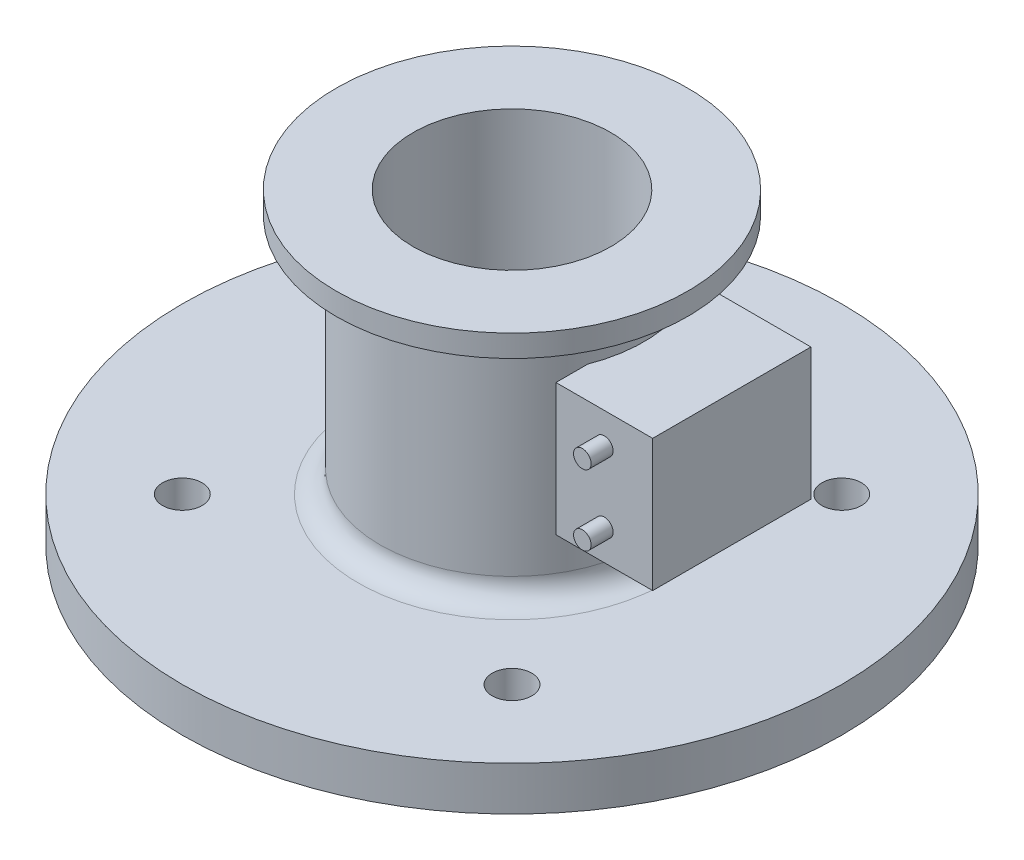
ISO-10303-21;
HEADER;
FILE_DESCRIPTION(('STEP AP214'),'2;1');
FILE_NAME('part.step','',(''),(''),'','','');
FILE_SCHEMA(('AUTOMOTIVE_DESIGN { 1 0 10303 214 1 1 1 1 }'));
ENDSEC;
DATA;
#1=APPLICATION_CONTEXT('core data for automotive mechanical design processes');
#2=APPLICATION_PROTOCOL_DEFINITION('international standard','automotive_design',2000,#1);
#3=PRODUCT_CONTEXT('',#1,'mechanical');
#4=PRODUCT('Part','Part','',(#3));
#5=PRODUCT_RELATED_PRODUCT_CATEGORY('part','',(#4));
#6=PRODUCT_DEFINITION_FORMATION('','',#4);
#7=PRODUCT_DEFINITION_CONTEXT('part definition',#1,'design');
#8=PRODUCT_DEFINITION('design','',#6,#7);
#9=PRODUCT_DEFINITION_SHAPE('','',#8);
#10=(LENGTH_UNIT() NAMED_UNIT(*) SI_UNIT(.MILLI.,.METRE.));
#11=(NAMED_UNIT(*) PLANE_ANGLE_UNIT() SI_UNIT($,.RADIAN.));
#12=(NAMED_UNIT(*) SI_UNIT($,.STERADIAN.) SOLID_ANGLE_UNIT());
#13=UNCERTAINTY_MEASURE_WITH_UNIT(LENGTH_MEASURE(1.E-05),#10,'distance_accuracy_value','');
#14=(GEOMETRIC_REPRESENTATION_CONTEXT(3) GLOBAL_UNCERTAINTY_ASSIGNED_CONTEXT((#13)) GLOBAL_UNIT_ASSIGNED_CONTEXT((#10,
#11,#12)) REPRESENTATION_CONTEXT('',''));
#15=CARTESIAN_POINT('',(0.,0.,0.));
#16=DIRECTION('',(0.,0.,1.));
#17=DIRECTION('',(1.,0.,0.));
#18=AXIS2_PLACEMENT_3D('',#15,#16,#17);
#19=CARTESIAN_POINT('',(50.,55.,18.));
#20=DIRECTION('',(-1.,0.,0.));
#21=DIRECTION('',(0.,0.,1.));
#22=AXIS2_PLACEMENT_3D('',#19,#20,#21);
#23=PLANE('',#22);
#24=DIRECTION('',(0.,0.,-1.));
#25=VECTOR('',#24,1.);
#26=CARTESIAN_POINT('',(50.,25.,18.));
#27=LINE('',#26,#25);
#28=CARTESIAN_POINT('',(50.,25.,18.));
#29=VERTEX_POINT('',#28);
#30=CARTESIAN_POINT('',(50.,25.,-18.));
#31=VERTEX_POINT('',#30);
#32=EDGE_CURVE('E113',#29,#31,#27,.T.);
#33=ORIENTED_EDGE('',*,*,#32,.T.);
#34=DIRECTION('',(0.,-1.,0.));
#35=VECTOR('',#34,1.);
#36=CARTESIAN_POINT('',(50.,55.,-18.));
#37=LINE('',#36,#35);
#38=CARTESIAN_POINT('',(50.,55.,-18.));
#39=VERTEX_POINT('',#38);
#40=EDGE_CURVE('E104',#39,#31,#37,.T.);
#41=ORIENTED_EDGE('',*,*,#40,.F.);
#42=DIRECTION('',(0.,0.,-1.));
#43=VECTOR('',#42,1.);
#44=CARTESIAN_POINT('',(50.,55.,18.));
#45=LINE('',#44,#43);
#46=CARTESIAN_POINT('',(50.,55.,18.));
#47=VERTEX_POINT('',#46);
#48=EDGE_CURVE('E98',#47,#39,#45,.T.);
#49=ORIENTED_EDGE('',*,*,#48,.F.);
#50=DIRECTION('',(0.,-1.,0.));
#51=VECTOR('',#50,1.);
#52=CARTESIAN_POINT('',(50.,55.,18.));
#53=LINE('',#52,#51);
#54=EDGE_CURVE('E109',#47,#29,#53,.T.);
#55=ORIENTED_EDGE('',*,*,#54,.T.);
#56=EDGE_LOOP('',(#33,#41,#49,#55));
#57=FACE_BOUND('',#56,.T.);
#58=ADVANCED_FACE('F46',(#57),#23,.F.);
#59=CARTESIAN_POINT('',(28.,55.,-18.));
#60=DIRECTION('',(0.,0.,1.));
#61=DIRECTION('',(1.,0.,0.));
#62=AXIS2_PLACEMENT_3D('',#59,#60,#61);
#63=PLANE('',#62);
#64=DIRECTION('',(-1.,0.,0.));
#65=VECTOR('',#64,1.);
#66=CARTESIAN_POINT('',(28.,25.,-18.));
#67=LINE('',#66,#65);
#68=CARTESIAN_POINT('',(28.,25.,-18.));
#69=VERTEX_POINT('',#68);
#70=EDGE_CURVE('E103',#31,#69,#67,.T.);
#71=ORIENTED_EDGE('',*,*,#70,.T.);
#72=DIRECTION('',(0.,-1.,0.));
#73=VECTOR('',#72,1.);
#74=CARTESIAN_POINT('',(28.,55.,-18.));
#75=LINE('',#74,#73);
#76=CARTESIAN_POINT('',(28.,55.,-18.));
#77=VERTEX_POINT('',#76);
#78=EDGE_CURVE('E101',#77,#69,#75,.T.);
#79=ORIENTED_EDGE('',*,*,#78,.F.);
#80=DIRECTION('',(-1.,0.,0.));
#81=VECTOR('',#80,1.);
#82=CARTESIAN_POINT('',(28.,55.,-18.));
#83=LINE('',#82,#81);
#84=EDGE_CURVE('E93',#39,#77,#83,.T.);
#85=ORIENTED_EDGE('',*,*,#84,.F.);
#86=ORIENTED_EDGE('',*,*,#40,.T.);
#87=EDGE_LOOP('',(#71,#79,#85,#86));
#88=FACE_BOUND('',#87,.T.);
#89=ADVANCED_FACE('F102',(#88),#63,.F.);
#90=CARTESIAN_POINT('',(28.,55.,18.));
#91=DIRECTION('',(1.,0.,0.));
#92=DIRECTION('',(0.,0.,-1.));
#93=AXIS2_PLACEMENT_3D('',#90,#91,#92);
#94=PLANE('',#93);
#95=DIRECTION('',(0.,0.,1.));
#96=VECTOR('',#95,1.);
#97=CARTESIAN_POINT('',(28.,25.,18.));
#98=LINE('',#97,#96);
#99=CARTESIAN_POINT('',(28.,25.,18.));
#100=VERTEX_POINT('',#99);
#101=EDGE_CURVE('E79',#69,#100,#98,.T.);
#102=ORIENTED_EDGE('',*,*,#101,.T.);
#103=DIRECTION('',(0.,-1.,0.));
#104=VECTOR('',#103,1.);
#105=CARTESIAN_POINT('',(28.,55.,18.));
#106=LINE('',#105,#104);
#107=CARTESIAN_POINT('',(28.,55.,18.));
#108=VERTEX_POINT('',#107);
#109=EDGE_CURVE('E105',#108,#100,#106,.T.);
#110=ORIENTED_EDGE('',*,*,#109,.F.);
#111=DIRECTION('',(0.,0.,1.));
#112=VECTOR('',#111,1.);
#113=CARTESIAN_POINT('',(28.,55.,18.));
#114=LINE('',#113,#112);
#115=EDGE_CURVE('E96',#77,#108,#114,.T.);
#116=ORIENTED_EDGE('',*,*,#115,.F.);
#117=ORIENTED_EDGE('',*,*,#78,.T.);
#118=EDGE_LOOP('',(#102,#110,#116,#117));
#119=FACE_BOUND('',#118,.T.);
#120=ADVANCED_FACE('F107',(#119),#94,.F.);
#121=CARTESIAN_POINT('',(28.,55.,18.));
#122=DIRECTION('',(0.,0.,-1.));
#123=DIRECTION('',(-1.,0.,0.));
#124=AXIS2_PLACEMENT_3D('',#121,#122,#123);
#125=PLANE('',#124);
#126=CARTESIAN_POINT('',(39.,32.,18.));
#127=DIRECTION('',(0.,0.,-1.));
#128=DIRECTION('',(-1.,0.,0.));
#129=AXIS2_PLACEMENT_3D('',#126,#127,#128);
#130=CIRCLE('',#129,2.);
#131=CARTESIAN_POINT('',(37.,32.,18.));
#132=VERTEX_POINT('',#131);
#133=EDGE_CURVE('E12',#132,#132,#130,.F.);
#134=ORIENTED_EDGE('',*,*,#133,.F.);
#135=EDGE_LOOP('',(#134));
#136=FACE_BOUND('',#135,.T.);
#137=CARTESIAN_POINT('',(39.,48.,18.));
#138=DIRECTION('',(0.,0.,-1.));
#139=DIRECTION('',(-1.,0.,0.));
#140=AXIS2_PLACEMENT_3D('',#137,#138,#139);
#141=CIRCLE('',#140,2.);
#142=CARTESIAN_POINT('',(37.,48.,18.));
#143=VERTEX_POINT('',#142);
#144=EDGE_CURVE('E54',#143,#143,#141,.F.);
#145=ORIENTED_EDGE('',*,*,#144,.F.);
#146=EDGE_LOOP('',(#145));
#147=FACE_BOUND('',#146,.T.);
#148=DIRECTION('',(1.,0.,0.));
#149=VECTOR('',#148,1.);
#150=CARTESIAN_POINT('',(28.,25.,18.));
#151=LINE('',#150,#149);
#152=EDGE_CURVE('E85',#100,#29,#151,.T.);
#153=ORIENTED_EDGE('',*,*,#152,.T.);
#154=ORIENTED_EDGE('',*,*,#54,.F.);
#155=DIRECTION('',(1.,0.,0.));
#156=VECTOR('',#155,1.);
#157=CARTESIAN_POINT('',(28.,55.,18.));
#158=LINE('',#157,#156);
#159=EDGE_CURVE('E62',#108,#47,#158,.T.);
#160=ORIENTED_EDGE('',*,*,#159,.F.);
#161=ORIENTED_EDGE('',*,*,#109,.T.);
#162=EDGE_LOOP('',(#153,#154,#160,#161));
#163=FACE_BOUND('',#162,.T.);
#164=ADVANCED_FACE('F127',(#136,#147,#163),#125,.F.);
#165=CARTESIAN_POINT('',(0.,55.,0.));
#166=DIRECTION('',(0.,-1.,0.));
#167=DIRECTION('',(0.,0.,-1.));
#168=AXIS2_PLACEMENT_3D('',#165,#166,#167);
#169=PLANE('',#168);
#170=ORIENTED_EDGE('',*,*,#48,.T.);
#171=ORIENTED_EDGE('',*,*,#84,.T.);
#172=ORIENTED_EDGE('',*,*,#115,.T.);
#173=ORIENTED_EDGE('',*,*,#159,.T.);
#174=EDGE_LOOP('',(#170,#171,#172,#173));
#175=FACE_BOUND('',#174,.T.);
#176=ADVANCED_FACE('F94',(#175),#169,.F.);
#177=CARTESIAN_POINT('',(0.,25.,0.));
#178=DIRECTION('',(0.,-1.,0.));
#179=DIRECTION('',(0.,0.,-1.));
#180=AXIS2_PLACEMENT_3D('',#177,#178,#179);
#181=PLANE('',#180);
#182=ORIENTED_EDGE('',*,*,#32,.F.);
#183=ORIENTED_EDGE('',*,*,#152,.F.);
#184=ORIENTED_EDGE('',*,*,#101,.F.);
#185=ORIENTED_EDGE('',*,*,#70,.F.);
#186=EDGE_LOOP('',(#182,#183,#184,#185));
#187=FACE_BOUND('',#186,.T.);
#188=ADVANCED_FACE('F135',(#187),#181,.T.);
#189=CARTESIAN_POINT('',(39.,48.,23.));
#190=DIRECTION('',(0.,0.,-1.));
#191=DIRECTION('',(-1.,0.,0.));
#192=AXIS2_PLACEMENT_3D('',#189,#190,#191);
#193=CYLINDRICAL_SURFACE('',#192,2.);
#194=CARTESIAN_POINT('',(39.,48.,23.));
#195=DIRECTION('',(0.,0.,1.));
#196=DIRECTION('',(1.,0.,0.));
#197=AXIS2_PLACEMENT_3D('',#194,#195,#196);
#198=CIRCLE('',#197,2.);
#199=CARTESIAN_POINT('',(41.,48.,23.));
#200=VERTEX_POINT('',#199);
#201=EDGE_CURVE('E116',#200,#200,#198,.T.);
#202=ORIENTED_EDGE('',*,*,#201,.F.);
#203=EDGE_LOOP('',(#202));
#204=FACE_BOUND('',#203,.T.);
#205=ORIENTED_EDGE('',*,*,#144,.T.);
#206=EDGE_LOOP('',(#205));
#207=FACE_BOUND('',#206,.T.);
#208=ADVANCED_FACE('F125',(#204,#207),#193,.T.);
#209=CARTESIAN_POINT('',(39.,48.,23.));
#210=DIRECTION('',(0.,0.,1.));
#211=DIRECTION('',(1.,0.,0.));
#212=AXIS2_PLACEMENT_3D('',#209,#210,#211);
#213=PLANE('',#212);
#214=ORIENTED_EDGE('',*,*,#201,.T.);
#215=EDGE_LOOP('',(#214));
#216=FACE_BOUND('',#215,.T.);
#217=ADVANCED_FACE('F151',(#216),#213,.T.);
#218=CARTESIAN_POINT('',(39.,32.,23.));
#219=DIRECTION('',(0.,0.,-1.));
#220=DIRECTION('',(-1.,0.,0.));
#221=AXIS2_PLACEMENT_3D('',#218,#219,#220);
#222=CYLINDRICAL_SURFACE('',#221,2.);
#223=CARTESIAN_POINT('',(39.,32.,23.));
#224=DIRECTION('',(0.,0.,1.));
#225=DIRECTION('',(1.,0.,0.));
#226=AXIS2_PLACEMENT_3D('',#223,#224,#225);
#227=CIRCLE('',#226,2.);
#228=CARTESIAN_POINT('',(41.,32.,23.));
#229=VERTEX_POINT('',#228);
#230=EDGE_CURVE('E169',#229,#229,#227,.T.);
#231=ORIENTED_EDGE('',*,*,#230,.F.);
#232=EDGE_LOOP('',(#231));
#233=FACE_BOUND('',#232,.T.);
#234=ORIENTED_EDGE('',*,*,#133,.T.);
#235=EDGE_LOOP('',(#234));
#236=FACE_BOUND('',#235,.T.);
#237=ADVANCED_FACE('F157',(#233,#236),#222,.T.);
#238=CARTESIAN_POINT('',(39.,32.,23.));
#239=DIRECTION('',(0.,0.,1.));
#240=DIRECTION('',(1.,0.,0.));
#241=AXIS2_PLACEMENT_3D('',#238,#239,#240);
#242=PLANE('',#241);
#243=ORIENTED_EDGE('',*,*,#230,.T.);
#244=EDGE_LOOP('',(#243));
#245=FACE_BOUND('',#244,.T.);
#246=ADVANCED_FACE('F161',(#245),#242,.T.);
#247=CLOSED_SHELL('',(#58,#89,#120,#164,#176,#188,#208,#217,#237,#246));
#248=MANIFOLD_SOLID_BREP('B2',#247);
#249=CARTESIAN_POINT('',(0.,70.,0.));
#250=DIRECTION('',(0.,-1.,0.));
#251=DIRECTION('',(0.,0.,-1.));
#252=AXIS2_PLACEMENT_3D('',#249,#250,#251);
#253=CYLINDRICAL_SURFACE('',#252,30.);
#254=CARTESIAN_POINT('',(0.,60.,0.));
#255=DIRECTION('',(0.,1.,0.));
#256=DIRECTION('',(0.,0.,1.));
#257=AXIS2_PLACEMENT_3D('',#254,#255,#256);
#258=CIRCLE('',#257,30.);
#259=CARTESIAN_POINT('',(0.,60.,30.));
#260=VERTEX_POINT('',#259);
#261=EDGE_CURVE('E236',#260,#260,#258,.F.);
#262=ORIENTED_EDGE('',*,*,#261,.T.);
#263=EDGE_LOOP('',(#262));
#264=FACE_BOUND('',#263,.T.);
#265=CARTESIAN_POINT('',(0.,15.,0.));
#266=DIRECTION('',(0.,-1.,0.));
#267=DIRECTION('',(0.,0.,-1.));
#268=AXIS2_PLACEMENT_3D('',#265,#266,#267);
#269=CIRCLE('',#268,30.);
#270=CARTESIAN_POINT('',(0.,15.,-30.));
#271=VERTEX_POINT('',#270);
#272=EDGE_CURVE('E240',#271,#271,#269,.F.);
#273=ORIENTED_EDGE('',*,*,#272,.T.);
#274=EDGE_LOOP('',(#273));
#275=FACE_BOUND('',#274,.T.);
#276=ADVANCED_FACE('F229',(#264,#275),#253,.T.);
#277=CARTESIAN_POINT('',(0.,10.,0.));
#278=DIRECTION('',(0.,-1.,0.));
#279=DIRECTION('',(0.,0.,-1.));
#280=AXIS2_PLACEMENT_3D('',#277,#278,#279);
#281=PLANE('',#280);
#282=CARTESIAN_POINT('',(0.,10.,0.));
#283=DIRECTION('',(0.,-1.,0.));
#284=DIRECTION('',(0.,0.,-1.));
#285=AXIS2_PLACEMENT_3D('',#282,#283,#284);
#286=CIRCLE('',#285,35.);
#287=CARTESIAN_POINT('',(0.,10.,-35.));
#288=VERTEX_POINT('',#287);
#289=EDGE_CURVE('E45',#288,#288,#286,.T.);
#290=ORIENTED_EDGE('',*,*,#289,.T.);
#291=EDGE_LOOP('',(#290));
#292=FACE_BOUND('',#291,.T.);
#293=CARTESIAN_POINT('',(-37.5,10.,-37.5));
#294=DIRECTION('',(0.,1.,0.));
#295=DIRECTION('',(0.,0.,1.));
#296=AXIS2_PLACEMENT_3D('',#293,#294,#295);
#297=CIRCLE('',#296,4.50000000000001);
#298=CARTESIAN_POINT('',(-37.5,10.,-33.));
#299=VERTEX_POINT('',#298);
#300=EDGE_CURVE('E249',#299,#299,#297,.T.);
#301=ORIENTED_EDGE('',*,*,#300,.F.);
#302=EDGE_LOOP('',(#301));
#303=FACE_BOUND('',#302,.T.);
#304=CARTESIAN_POINT('',(37.5,10.,-37.5));
#305=DIRECTION('',(0.,1.,0.));
#306=DIRECTION('',(0.,0.,1.));
#307=AXIS2_PLACEMENT_3D('',#304,#305,#306);
#308=CIRCLE('',#307,4.5);
#309=CARTESIAN_POINT('',(37.5,10.,-33.));
#310=VERTEX_POINT('',#309);
#311=EDGE_CURVE('E253',#310,#310,#308,.T.);
#312=ORIENTED_EDGE('',*,*,#311,.F.);
#313=EDGE_LOOP('',(#312));
#314=FACE_BOUND('',#313,.T.);
#315=CARTESIAN_POINT('',(37.5,10.,37.5));
#316=DIRECTION('',(0.,1.,0.));
#317=DIRECTION('',(0.,0.,1.));
#318=AXIS2_PLACEMENT_3D('',#315,#316,#317);
#319=CIRCLE('',#318,4.5);
#320=CARTESIAN_POINT('',(37.5,10.,42.));
#321=VERTEX_POINT('',#320);
#322=EDGE_CURVE('E259',#321,#321,#319,.T.);
#323=ORIENTED_EDGE('',*,*,#322,.F.);
#324=EDGE_LOOP('',(#323));
#325=FACE_BOUND('',#324,.T.);
#326=CARTESIAN_POINT('',(-37.5,10.,37.5));
#327=DIRECTION('',(0.,1.,0.));
#328=DIRECTION('',(0.,0.,1.));
#329=AXIS2_PLACEMENT_3D('',#326,#327,#328);
#330=CIRCLE('',#329,4.50000000000001);
#331=CARTESIAN_POINT('',(-37.5,10.,42.));
#332=VERTEX_POINT('',#331);
#333=EDGE_CURVE('E265',#332,#332,#330,.T.);
#334=ORIENTED_EDGE('',*,*,#333,.F.);
#335=EDGE_LOOP('',(#334));
#336=FACE_BOUND('',#335,.T.);
#337=CARTESIAN_POINT('',(0.,10.,0.));
#338=DIRECTION('',(0.,1.,0.));
#339=DIRECTION('',(0.,0.,1.));
#340=AXIS2_PLACEMENT_3D('',#337,#338,#339);
#341=CIRCLE('',#340,75.);
#342=CARTESIAN_POINT('',(0.,10.,75.));
#343=VERTEX_POINT('',#342);
#344=EDGE_CURVE('E283',#343,#343,#341,.T.);
#345=ORIENTED_EDGE('',*,*,#344,.T.);
#346=EDGE_LOOP('',(#345));
#347=FACE_BOUND('',#346,.T.);
#348=ADVANCED_FACE('F292',(#292,#303,#314,#325,#336,#347),#281,.F.);
#349=CARTESIAN_POINT('',(0.,0.,0.));
#350=DIRECTION('',(0.,-1.,0.));
#351=DIRECTION('',(0.,0.,-1.));
#352=AXIS2_PLACEMENT_3D('',#349,#350,#351);
#353=PLANE('',#352);
#354=CARTESIAN_POINT('',(37.5,0.,37.5));
#355=DIRECTION('',(0.,1.,0.));
#356=DIRECTION('',(0.,0.,1.));
#357=AXIS2_PLACEMENT_3D('',#354,#355,#356);
#358=CIRCLE('',#357,4.5);
#359=CARTESIAN_POINT('',(37.5,0.,42.));
#360=VERTEX_POINT('',#359);
#361=EDGE_CURVE('E262',#360,#360,#358,.T.);
#362=ORIENTED_EDGE('',*,*,#361,.T.);
#363=EDGE_LOOP('',(#362));
#364=FACE_BOUND('',#363,.T.);
#365=CARTESIAN_POINT('',(-37.5,0.,-37.5));
#366=DIRECTION('',(0.,1.,0.));
#367=DIRECTION('',(0.,0.,1.));
#368=AXIS2_PLACEMENT_3D('',#365,#366,#367);
#369=CIRCLE('',#368,4.50000000000001);
#370=CARTESIAN_POINT('',(-37.5,0.,-33.));
#371=VERTEX_POINT('',#370);
#372=EDGE_CURVE('E250',#371,#371,#369,.T.);
#373=ORIENTED_EDGE('',*,*,#372,.T.);
#374=EDGE_LOOP('',(#373));
#375=FACE_BOUND('',#374,.T.);
#376=CARTESIAN_POINT('',(37.5,0.,-37.5));
#377=DIRECTION('',(0.,1.,0.));
#378=DIRECTION('',(0.,0.,1.));
#379=AXIS2_PLACEMENT_3D('',#376,#377,#378);
#380=CIRCLE('',#379,4.5);
#381=CARTESIAN_POINT('',(37.5,0.,-33.));
#382=VERTEX_POINT('',#381);
#383=EDGE_CURVE('E256',#382,#382,#380,.T.);
#384=ORIENTED_EDGE('',*,*,#383,.T.);
#385=EDGE_LOOP('',(#384));
#386=FACE_BOUND('',#385,.T.);
#387=CARTESIAN_POINT('',(-37.5,0.,37.5));
#388=DIRECTION('',(0.,1.,0.));
#389=DIRECTION('',(0.,0.,1.));
#390=AXIS2_PLACEMENT_3D('',#387,#388,#389);
#391=CIRCLE('',#390,4.50000000000001);
#392=CARTESIAN_POINT('',(-37.5,0.,42.));
#393=VERTEX_POINT('',#392);
#394=EDGE_CURVE('E268',#393,#393,#391,.T.);
#395=ORIENTED_EDGE('',*,*,#394,.T.);
#396=EDGE_LOOP('',(#395));
#397=FACE_BOUND('',#396,.T.);
#398=CARTESIAN_POINT('',(0.,0.,0.));
#399=DIRECTION('',(0.,1.,0.));
#400=DIRECTION('',(0.,0.,1.));
#401=AXIS2_PLACEMENT_3D('',#398,#399,#400);
#402=CIRCLE('',#401,75.);
#403=CARTESIAN_POINT('',(0.,0.,75.));
#404=VERTEX_POINT('',#403);
#405=EDGE_CURVE('E286',#404,#404,#402,.T.);
#406=ORIENTED_EDGE('',*,*,#405,.F.);
#407=EDGE_LOOP('',(#406));
#408=FACE_BOUND('',#407,.T.);
#409=ADVANCED_FACE('F300',(#364,#375,#386,#397,#408),#353,.T.);
#410=CARTESIAN_POINT('',(-37.5,10.,-37.5));
#411=DIRECTION('',(0.,-1.,0.));
#412=DIRECTION('',(0.,0.,-1.));
#413=AXIS2_PLACEMENT_3D('',#410,#411,#412);
#414=CYLINDRICAL_SURFACE('',#413,4.50000000000001);
#415=ORIENTED_EDGE('',*,*,#300,.T.);
#416=EDGE_LOOP('',(#415));
#417=FACE_BOUND('',#416,.T.);
#418=ORIENTED_EDGE('',*,*,#372,.F.);
#419=EDGE_LOOP('',(#418));
#420=FACE_BOUND('',#419,.T.);
#421=ADVANCED_FACE('F302',(#417,#420),#414,.F.);
#422=CARTESIAN_POINT('',(37.5,10.,-37.5));
#423=DIRECTION('',(0.,-1.,0.));
#424=DIRECTION('',(0.,0.,-1.));
#425=AXIS2_PLACEMENT_3D('',#422,#423,#424);
#426=CYLINDRICAL_SURFACE('',#425,4.5);
#427=ORIENTED_EDGE('',*,*,#311,.T.);
#428=EDGE_LOOP('',(#427));
#429=FACE_BOUND('',#428,.T.);
#430=ORIENTED_EDGE('',*,*,#383,.F.);
#431=EDGE_LOOP('',(#430));
#432=FACE_BOUND('',#431,.T.);
#433=ADVANCED_FACE('F309',(#429,#432),#426,.F.);
#434=CARTESIAN_POINT('',(37.5,10.,37.5));
#435=DIRECTION('',(0.,-1.,0.));
#436=DIRECTION('',(0.,0.,-1.));
#437=AXIS2_PLACEMENT_3D('',#434,#435,#436);
#438=CYLINDRICAL_SURFACE('',#437,4.5);
#439=ORIENTED_EDGE('',*,*,#322,.T.);
#440=EDGE_LOOP('',(#439));
#441=FACE_BOUND('',#440,.T.);
#442=ORIENTED_EDGE('',*,*,#361,.F.);
#443=EDGE_LOOP('',(#442));
#444=FACE_BOUND('',#443,.T.);
#445=ADVANCED_FACE('F328',(#441,#444),#438,.F.);
#446=CARTESIAN_POINT('',(-37.5,10.,37.5));
#447=DIRECTION('',(0.,-1.,0.));
#448=DIRECTION('',(0.,0.,-1.));
#449=AXIS2_PLACEMENT_3D('',#446,#447,#448);
#450=CYLINDRICAL_SURFACE('',#449,4.50000000000001);
#451=ORIENTED_EDGE('',*,*,#333,.T.);
#452=EDGE_LOOP('',(#451));
#453=FACE_BOUND('',#452,.T.);
#454=ORIENTED_EDGE('',*,*,#394,.F.);
#455=EDGE_LOOP('',(#454));
#456=FACE_BOUND('',#455,.T.);
#457=ADVANCED_FACE('F324',(#453,#456),#450,.F.);
#458=CARTESIAN_POINT('',(0.,65.,0.));
#459=DIRECTION('',(0.,1.,0.));
#460=DIRECTION('',(0.,0.,1.));
#461=AXIS2_PLACEMENT_3D('',#458,#459,#460);
#462=CYLINDRICAL_SURFACE('',#461,40.);
#463=CARTESIAN_POINT('',(0.,65.,0.));
#464=DIRECTION('',(0.,1.,0.));
#465=DIRECTION('',(0.,0.,1.));
#466=AXIS2_PLACEMENT_3D('',#463,#464,#465);
#467=CIRCLE('',#466,40.);
#468=CARTESIAN_POINT('',(0.,65.,40.));
#469=VERTEX_POINT('',#468);
#470=EDGE_CURVE('E277',#469,#469,#467,.T.);
#471=ORIENTED_EDGE('',*,*,#470,.T.);
#472=EDGE_LOOP('',(#471));
#473=FACE_BOUND('',#472,.T.);
#474=CARTESIAN_POINT('',(0.,70.,0.));
#475=DIRECTION('',(0.,1.,0.));
#476=DIRECTION('',(0.,0.,1.));
#477=AXIS2_PLACEMENT_3D('',#474,#475,#476);
#478=CIRCLE('',#477,40.);
#479=CARTESIAN_POINT('',(0.,70.,40.));
#480=VERTEX_POINT('',#479);
#481=EDGE_CURVE('E280',#480,#480,#478,.T.);
#482=ORIENTED_EDGE('',*,*,#481,.F.);
#483=EDGE_LOOP('',(#482));
#484=FACE_BOUND('',#483,.T.);
#485=ADVANCED_FACE('F327',(#473,#484),#462,.T.);
#486=CARTESIAN_POINT('',(0.,65.,0.));
#487=DIRECTION('',(0.,1.,0.));
#488=DIRECTION('',(0.,0.,1.));
#489=AXIS2_PLACEMENT_3D('',#486,#487,#488);
#490=PLANE('',#489);
#491=CARTESIAN_POINT('',(0.,65.,0.));
#492=DIRECTION('',(0.,1.,0.));
#493=DIRECTION('',(0.,0.,1.));
#494=AXIS2_PLACEMENT_3D('',#491,#492,#493);
#495=CIRCLE('',#494,35.);
#496=CARTESIAN_POINT('',(0.,65.,35.));
#497=VERTEX_POINT('',#496);
#498=EDGE_CURVE('E244',#497,#497,#495,.T.);
#499=ORIENTED_EDGE('',*,*,#498,.T.);
#500=EDGE_LOOP('',(#499));
#501=FACE_BOUND('',#500,.T.);
#502=ORIENTED_EDGE('',*,*,#470,.F.);
#503=EDGE_LOOP('',(#502));
#504=FACE_BOUND('',#503,.T.);
#505=ADVANCED_FACE('F368',(#501,#504),#490,.F.);
#506=CARTESIAN_POINT('',(0.,10.,0.));
#507=DIRECTION('',(0.,1.,0.));
#508=DIRECTION('',(0.,0.,1.));
#509=AXIS2_PLACEMENT_3D('',#506,#507,#508);
#510=CIRCLE('',#509,22.5);
#511=CARTESIAN_POINT('',(0.,10.,22.5));
#512=VERTEX_POINT('',#511);
#513=EDGE_CURVE('E274',#512,#512,#510,.T.);
#514=ORIENTED_EDGE('',*,*,#513,.T.);
#515=EDGE_LOOP('',(#514));
#516=FACE_BOUND('',#515,.T.);
#517=ADVANCED_FACE('F313',(#516),#281,.F.);
#518=CARTESIAN_POINT('',(0.,70.,0.));
#519=DIRECTION('',(0.,-1.,0.));
#520=DIRECTION('',(0.,0.,-1.));
#521=AXIS2_PLACEMENT_3D('',#518,#519,#520);
#522=CYLINDRICAL_SURFACE('',#521,22.5);
#523=CARTESIAN_POINT('',(0.,70.,0.));
#524=DIRECTION('',(0.,1.,0.));
#525=DIRECTION('',(0.,0.,1.));
#526=AXIS2_PLACEMENT_3D('',#523,#524,#525);
#527=CIRCLE('',#526,22.5);
#528=CARTESIAN_POINT('',(0.,70.,22.5));
#529=VERTEX_POINT('',#528);
#530=EDGE_CURVE('E271',#529,#529,#527,.T.);
#531=ORIENTED_EDGE('',*,*,#530,.T.);
#532=EDGE_LOOP('',(#531));
#533=FACE_BOUND('',#532,.T.);
#534=ORIENTED_EDGE('',*,*,#513,.F.);
#535=EDGE_LOOP('',(#534));
#536=FACE_BOUND('',#535,.T.);
#537=ADVANCED_FACE('F385',(#533,#536),#522,.F.);
#538=CARTESIAN_POINT('',(0.,70.,0.));
#539=DIRECTION('',(0.,1.,0.));
#540=DIRECTION('',(0.,0.,1.));
#541=AXIS2_PLACEMENT_3D('',#538,#539,#540);
#542=PLANE('',#541);
#543=ORIENTED_EDGE('',*,*,#530,.F.);
#544=EDGE_LOOP('',(#543));
#545=FACE_BOUND('',#544,.T.);
#546=ORIENTED_EDGE('',*,*,#481,.T.);
#547=EDGE_LOOP('',(#546));
#548=FACE_BOUND('',#547,.T.);
#549=ADVANCED_FACE('F322',(#545,#548),#542,.T.);
#550=CARTESIAN_POINT('',(0.,60.,0.));
#551=DIRECTION('',(0.,1.,0.));
#552=DIRECTION('',(0.,0.,1.));
#553=AXIS2_PLACEMENT_3D('',#550,#551,#552);
#554=TOROIDAL_SURFACE('',#553,35.,5.);
#555=ORIENTED_EDGE('',*,*,#261,.F.);
#556=EDGE_LOOP('',(#555));
#557=FACE_BOUND('',#556,.T.);
#558=ORIENTED_EDGE('',*,*,#498,.F.);
#559=EDGE_LOOP('',(#558));
#560=FACE_BOUND('',#559,.T.);
#561=ADVANCED_FACE('F396',(#557,#560),#554,.F.);
#562=CARTESIAN_POINT('',(0.,15.,0.));
#563=DIRECTION('',(0.,-1.,0.));
#564=DIRECTION('',(0.,0.,-1.));
#565=AXIS2_PLACEMENT_3D('',#562,#563,#564);
#566=TOROIDAL_SURFACE('',#565,35.,5.);
#567=ORIENTED_EDGE('',*,*,#289,.F.);
#568=EDGE_LOOP('',(#567));
#569=FACE_BOUND('',#568,.T.);
#570=ORIENTED_EDGE('',*,*,#272,.F.);
#571=EDGE_LOOP('',(#570));
#572=FACE_BOUND('',#571,.T.);
#573=ADVANCED_FACE('F231',(#569,#572),#566,.F.);
#574=CARTESIAN_POINT('',(0.,10.,0.));
#575=DIRECTION('',(0.,-1.,0.));
#576=DIRECTION('',(0.,0.,-1.));
#577=AXIS2_PLACEMENT_3D('',#574,#575,#576);
#578=CYLINDRICAL_SURFACE('',#577,75.);
#579=ORIENTED_EDGE('',*,*,#344,.F.);
#580=EDGE_LOOP('',(#579));
#581=FACE_BOUND('',#580,.T.);
#582=ORIENTED_EDGE('',*,*,#405,.T.);
#583=EDGE_LOOP('',(#582));
#584=FACE_BOUND('',#583,.T.);
#585=ADVANCED_FACE('F294',(#581,#584),#578,.T.);
#586=CLOSED_SHELL('',(#276,#348,#409,#421,#433,#445,#457,#485,#505,#517,#537,#549,#561,#573,#585));
#587=MANIFOLD_SOLID_BREP('B6',#586);
#588=ADVANCED_BREP_SHAPE_REPRESENTATION('',(#18,#248,#587),#14);
#589=SHAPE_DEFINITION_REPRESENTATION(#9,#588);
ENDSEC;
END-ISO-10303-21;
